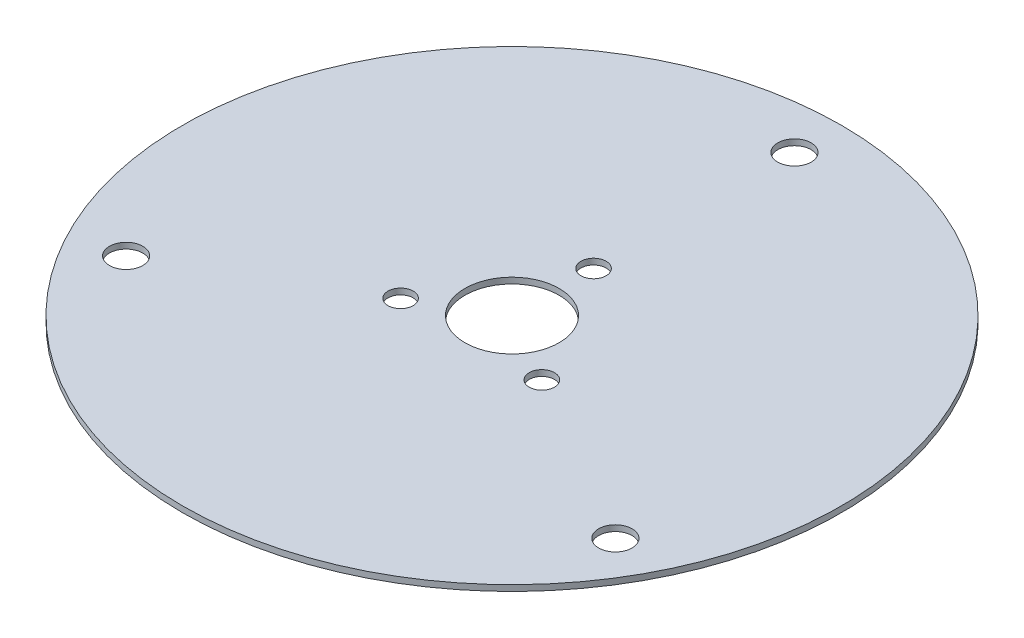
ISO-10303-21;
HEADER;
FILE_DESCRIPTION(('STEP AP214'),'2;1');
FILE_NAME('part.step','',(''),(''),'','','');
FILE_SCHEMA(('AUTOMOTIVE_DESIGN { 1 0 10303 214 1 1 1 1 }'));
ENDSEC;
DATA;
#1=APPLICATION_CONTEXT('core data for automotive mechanical design processes');
#2=APPLICATION_PROTOCOL_DEFINITION('international standard','automotive_design',2000,#1);
#3=PRODUCT_CONTEXT('',#1,'mechanical');
#4=PRODUCT('Part','Part','',(#3));
#5=PRODUCT_RELATED_PRODUCT_CATEGORY('part','',(#4));
#6=PRODUCT_DEFINITION_FORMATION('','',#4);
#7=PRODUCT_DEFINITION_CONTEXT('part definition',#1,'design');
#8=PRODUCT_DEFINITION('design','',#6,#7);
#9=PRODUCT_DEFINITION_SHAPE('','',#8);
#10=(LENGTH_UNIT() NAMED_UNIT(*) SI_UNIT(.MILLI.,.METRE.));
#11=(NAMED_UNIT(*) PLANE_ANGLE_UNIT() SI_UNIT($,.RADIAN.));
#12=(NAMED_UNIT(*) SI_UNIT($,.STERADIAN.) SOLID_ANGLE_UNIT());
#13=UNCERTAINTY_MEASURE_WITH_UNIT(LENGTH_MEASURE(1.E-05),#10,'distance_accuracy_value','');
#14=(GEOMETRIC_REPRESENTATION_CONTEXT(3) GLOBAL_UNCERTAINTY_ASSIGNED_CONTEXT((#13)) GLOBAL_UNIT_ASSIGNED_CONTEXT((#10,
#11,#12)) REPRESENTATION_CONTEXT('',''));
#15=CARTESIAN_POINT('',(0.,0.,0.));
#16=DIRECTION('',(0.,0.,1.));
#17=DIRECTION('',(1.,0.,0.));
#18=AXIS2_PLACEMENT_3D('',#15,#16,#17);
#19=CARTESIAN_POINT('',(0.,0.8,0.));
#20=DIRECTION('',(0.,-1.,0.));
#21=DIRECTION('',(0.,0.,-1.));
#22=AXIS2_PLACEMENT_3D('',#19,#20,#21);
#23=CYLINDRICAL_SURFACE('',#22,44.45);
#24=CARTESIAN_POINT('',(0.,0.8,0.));
#25=DIRECTION('',(0.,1.,0.));
#26=DIRECTION('',(0.,0.,1.));
#27=AXIS2_PLACEMENT_3D('',#24,#25,#26);
#28=CIRCLE('',#27,44.45);
#29=CARTESIAN_POINT('',(0.,0.8,44.45));
#30=VERTEX_POINT('',#29);
#31=EDGE_CURVE('E10',#30,#30,#28,.T.);
#32=ORIENTED_EDGE('',*,*,#31,.F.);
#33=EDGE_LOOP('',(#32));
#34=FACE_BOUND('',#33,.T.);
#35=CARTESIAN_POINT('',(0.,0.,0.));
#36=DIRECTION('',(0.,1.,0.));
#37=DIRECTION('',(0.,0.,1.));
#38=AXIS2_PLACEMENT_3D('',#35,#36,#37);
#39=CIRCLE('',#38,44.45);
#40=CARTESIAN_POINT('',(0.,0.,44.45));
#41=VERTEX_POINT('',#40);
#42=EDGE_CURVE('E38',#41,#41,#39,.T.);
#43=ORIENTED_EDGE('',*,*,#42,.T.);
#44=EDGE_LOOP('',(#43));
#45=FACE_BOUND('',#44,.T.);
#46=ADVANCED_FACE('F35',(#34,#45),#23,.T.);
#47=CARTESIAN_POINT('',(0.,0.8,0.));
#48=DIRECTION('',(0.,1.,0.));
#49=DIRECTION('',(0.,0.,1.));
#50=AXIS2_PLACEMENT_3D('',#47,#48,#49);
#51=PLANE('',#50);
#52=CARTESIAN_POINT('',(0.,0.800000000000001,-11.));
#53=DIRECTION('',(0.,1.,0.));
#54=DIRECTION('',(0.,0.,1.));
#55=AXIS2_PLACEMENT_3D('',#52,#53,#54);
#56=CIRCLE('',#55,1.69999999999999);
#57=CARTESIAN_POINT('',(0.,0.800000000000001,-9.30000000000001));
#58=VERTEX_POINT('',#57);
#59=EDGE_CURVE('E100',#58,#58,#56,.T.);
#60=ORIENTED_EDGE('',*,*,#59,.F.);
#61=EDGE_LOOP('',(#60));
#62=FACE_BOUND('',#61,.T.);
#63=CARTESIAN_POINT('',(-9.52627944162882,0.800000000000001,5.5));
#64=DIRECTION('',(0.,1.,0.));
#65=DIRECTION('',(0.,0.,1.));
#66=AXIS2_PLACEMENT_3D('',#63,#64,#65);
#67=CIRCLE('',#66,1.69999999999999);
#68=CARTESIAN_POINT('',(-9.52627944162882,0.800000000000001,7.19999999999999));
#69=VERTEX_POINT('',#68);
#70=EDGE_CURVE('E92',#69,#69,#67,.T.);
#71=ORIENTED_EDGE('',*,*,#70,.F.);
#72=EDGE_LOOP('',(#71));
#73=FACE_BOUND('',#72,.T.);
#74=CARTESIAN_POINT('',(9.52627944162882,0.800000000000001,5.5));
#75=DIRECTION('',(0.,1.,0.));
#76=DIRECTION('',(0.,0.,1.));
#77=AXIS2_PLACEMENT_3D('',#74,#75,#76);
#78=CIRCLE('',#77,1.69999999999999);
#79=CARTESIAN_POINT('',(9.52627944162882,0.800000000000001,7.19999999999999));
#80=VERTEX_POINT('',#79);
#81=EDGE_CURVE('E84',#80,#80,#78,.T.);
#82=ORIENTED_EDGE('',*,*,#81,.F.);
#83=EDGE_LOOP('',(#82));
#84=FACE_BOUND('',#83,.T.);
#85=CARTESIAN_POINT('',(0.,0.8,0.));
#86=DIRECTION('',(0.,1.,0.));
#87=DIRECTION('',(0.,0.,1.));
#88=AXIS2_PLACEMENT_3D('',#85,#86,#87);
#89=CIRCLE('',#88,6.35);
#90=CARTESIAN_POINT('',(0.,0.8,6.35));
#91=VERTEX_POINT('',#90);
#92=EDGE_CURVE('E73',#91,#91,#89,.T.);
#93=ORIENTED_EDGE('',*,*,#92,.F.);
#94=EDGE_LOOP('',(#93));
#95=FACE_BOUND('',#94,.T.);
#96=CARTESIAN_POINT('',(0.,0.8,-38.1));
#97=DIRECTION('',(0.,1.,0.));
#98=DIRECTION('',(0.,0.,1.));
#99=AXIS2_PLACEMENT_3D('',#96,#97,#98);
#100=CIRCLE('',#99,2.25);
#101=CARTESIAN_POINT('',(0.,0.8,-35.85));
#102=VERTEX_POINT('',#101);
#103=EDGE_CURVE('E68',#102,#102,#100,.T.);
#104=ORIENTED_EDGE('',*,*,#103,.F.);
#105=EDGE_LOOP('',(#104));
#106=FACE_BOUND('',#105,.T.);
#107=CARTESIAN_POINT('',(-32.9955678841873,0.8,19.0499999999997));
#108=DIRECTION('',(0.,1.,0.));
#109=DIRECTION('',(0.,0.,1.));
#110=AXIS2_PLACEMENT_3D('',#107,#108,#109);
#111=CIRCLE('',#110,2.25);
#112=CARTESIAN_POINT('',(-32.9955678841873,0.8,21.2999999999997));
#113=VERTEX_POINT('',#112);
#114=EDGE_CURVE('E60',#113,#113,#111,.T.);
#115=ORIENTED_EDGE('',*,*,#114,.F.);
#116=EDGE_LOOP('',(#115));
#117=FACE_BOUND('',#116,.T.);
#118=CARTESIAN_POINT('',(32.995567884187,0.8,19.0500000000002));
#119=DIRECTION('',(0.,1.,0.));
#120=DIRECTION('',(0.,0.,1.));
#121=AXIS2_PLACEMENT_3D('',#118,#119,#120);
#122=CIRCLE('',#121,2.25);
#123=CARTESIAN_POINT('',(32.995567884187,0.8,21.3000000000002));
#124=VERTEX_POINT('',#123);
#125=EDGE_CURVE('E52',#124,#124,#122,.T.);
#126=ORIENTED_EDGE('',*,*,#125,.F.);
#127=EDGE_LOOP('',(#126));
#128=FACE_BOUND('',#127,.T.);
#129=ORIENTED_EDGE('',*,*,#31,.T.);
#130=EDGE_LOOP('',(#129));
#131=FACE_BOUND('',#130,.T.);
#132=ADVANCED_FACE('F107',(#62,#73,#84,#95,#106,#117,#128,#131),#51,.T.);
#133=CARTESIAN_POINT('',(0.,0.,0.));
#134=DIRECTION('',(0.,1.,0.));
#135=DIRECTION('',(0.,0.,1.));
#136=AXIS2_PLACEMENT_3D('',#133,#134,#135);
#137=PLANE('',#136);
#138=CARTESIAN_POINT('',(0.,0.,-11.));
#139=DIRECTION('',(0.,1.,0.));
#140=DIRECTION('',(0.,0.,1.));
#141=AXIS2_PLACEMENT_3D('',#138,#139,#140);
#142=CIRCLE('',#141,1.7);
#143=CARTESIAN_POINT('',(0.,0.,-9.3));
#144=VERTEX_POINT('',#143);
#145=EDGE_CURVE('E96',#144,#144,#142,.T.);
#146=ORIENTED_EDGE('',*,*,#145,.T.);
#147=EDGE_LOOP('',(#146));
#148=FACE_BOUND('',#147,.T.);
#149=CARTESIAN_POINT('',(-9.52627944162882,0.,5.5));
#150=DIRECTION('',(0.,1.,0.));
#151=DIRECTION('',(0.,0.,1.));
#152=AXIS2_PLACEMENT_3D('',#149,#150,#151);
#153=CIRCLE('',#152,1.7);
#154=CARTESIAN_POINT('',(-9.52627944162882,0.,7.2));
#155=VERTEX_POINT('',#154);
#156=EDGE_CURVE('E88',#155,#155,#153,.T.);
#157=ORIENTED_EDGE('',*,*,#156,.T.);
#158=EDGE_LOOP('',(#157));
#159=FACE_BOUND('',#158,.T.);
#160=CARTESIAN_POINT('',(9.52627944162882,0.,5.5));
#161=DIRECTION('',(0.,1.,0.));
#162=DIRECTION('',(0.,0.,1.));
#163=AXIS2_PLACEMENT_3D('',#160,#161,#162);
#164=CIRCLE('',#163,1.7);
#165=CARTESIAN_POINT('',(9.52627944162882,0.,7.2));
#166=VERTEX_POINT('',#165);
#167=EDGE_CURVE('E77',#166,#166,#164,.T.);
#168=ORIENTED_EDGE('',*,*,#167,.T.);
#169=EDGE_LOOP('',(#168));
#170=FACE_BOUND('',#169,.T.);
#171=CARTESIAN_POINT('',(0.,0.,0.));
#172=DIRECTION('',(0.,1.,0.));
#173=DIRECTION('',(0.,0.,1.));
#174=AXIS2_PLACEMENT_3D('',#171,#172,#173);
#175=CIRCLE('',#174,6.35);
#176=CARTESIAN_POINT('',(0.,0.,6.35));
#177=VERTEX_POINT('',#176);
#178=EDGE_CURVE('E72',#177,#177,#175,.T.);
#179=ORIENTED_EDGE('',*,*,#178,.T.);
#180=EDGE_LOOP('',(#179));
#181=FACE_BOUND('',#180,.T.);
#182=CARTESIAN_POINT('',(0.,0.,-38.1));
#183=DIRECTION('',(0.,1.,0.));
#184=DIRECTION('',(0.,0.,1.));
#185=AXIS2_PLACEMENT_3D('',#182,#183,#184);
#186=CIRCLE('',#185,2.25);
#187=CARTESIAN_POINT('',(0.,0.,-35.85));
#188=VERTEX_POINT('',#187);
#189=EDGE_CURVE('E64',#188,#188,#186,.T.);
#190=ORIENTED_EDGE('',*,*,#189,.T.);
#191=EDGE_LOOP('',(#190));
#192=FACE_BOUND('',#191,.T.);
#193=CARTESIAN_POINT('',(-32.9955678841873,0.,19.0499999999997));
#194=DIRECTION('',(0.,1.,0.));
#195=DIRECTION('',(0.,0.,1.));
#196=AXIS2_PLACEMENT_3D('',#193,#194,#195);
#197=CIRCLE('',#196,2.25);
#198=CARTESIAN_POINT('',(-32.9955678841873,0.,21.2999999999997));
#199=VERTEX_POINT('',#198);
#200=EDGE_CURVE('E56',#199,#199,#197,.T.);
#201=ORIENTED_EDGE('',*,*,#200,.T.);
#202=EDGE_LOOP('',(#201));
#203=FACE_BOUND('',#202,.T.);
#204=CARTESIAN_POINT('',(32.995567884187,0.,19.0500000000002));
#205=DIRECTION('',(0.,1.,0.));
#206=DIRECTION('',(0.,0.,1.));
#207=AXIS2_PLACEMENT_3D('',#204,#205,#206);
#208=CIRCLE('',#207,2.25);
#209=CARTESIAN_POINT('',(32.995567884187,0.,21.3000000000002));
#210=VERTEX_POINT('',#209);
#211=EDGE_CURVE('E47',#210,#210,#208,.T.);
#212=ORIENTED_EDGE('',*,*,#211,.T.);
#213=EDGE_LOOP('',(#212));
#214=FACE_BOUND('',#213,.T.);
#215=ORIENTED_EDGE('',*,*,#42,.F.);
#216=EDGE_LOOP('',(#215));
#217=FACE_BOUND('',#216,.T.);
#218=ADVANCED_FACE('F110',(#148,#159,#170,#181,#192,#203,#214,#217),#137,.F.);
#219=CARTESIAN_POINT('',(32.995567884187,0.8,19.0500000000002));
#220=DIRECTION('',(0.,1.,0.));
#221=DIRECTION('',(0.,0.,1.));
#222=AXIS2_PLACEMENT_3D('',#219,#220,#221);
#223=CYLINDRICAL_SURFACE('',#222,2.25);
#224=ORIENTED_EDGE('',*,*,#211,.F.);
#225=EDGE_LOOP('',(#224));
#226=FACE_BOUND('',#225,.T.);
#227=ORIENTED_EDGE('',*,*,#125,.T.);
#228=EDGE_LOOP('',(#227));
#229=FACE_BOUND('',#228,.T.);
#230=ADVANCED_FACE('F124',(#226,#229),#223,.F.);
#231=CARTESIAN_POINT('',(-32.9955678841873,0.8,19.0499999999997));
#232=DIRECTION('',(0.,1.,0.));
#233=DIRECTION('',(0.,0.,1.));
#234=AXIS2_PLACEMENT_3D('',#231,#232,#233);
#235=CYLINDRICAL_SURFACE('',#234,2.25);
#236=ORIENTED_EDGE('',*,*,#200,.F.);
#237=EDGE_LOOP('',(#236));
#238=FACE_BOUND('',#237,.T.);
#239=ORIENTED_EDGE('',*,*,#114,.T.);
#240=EDGE_LOOP('',(#239));
#241=FACE_BOUND('',#240,.T.);
#242=ADVANCED_FACE('F126',(#238,#241),#235,.F.);
#243=CARTESIAN_POINT('',(0.,0.8,-38.1));
#244=DIRECTION('',(0.,1.,0.));
#245=DIRECTION('',(0.,0.,1.));
#246=AXIS2_PLACEMENT_3D('',#243,#244,#245);
#247=CYLINDRICAL_SURFACE('',#246,2.25);
#248=ORIENTED_EDGE('',*,*,#189,.F.);
#249=EDGE_LOOP('',(#248));
#250=FACE_BOUND('',#249,.T.);
#251=ORIENTED_EDGE('',*,*,#103,.T.);
#252=EDGE_LOOP('',(#251));
#253=FACE_BOUND('',#252,.T.);
#254=ADVANCED_FACE('F133',(#250,#253),#247,.F.);
#255=CARTESIAN_POINT('',(0.,0.,0.));
#256=DIRECTION('',(0.,1.,0.));
#257=DIRECTION('',(0.,0.,1.));
#258=AXIS2_PLACEMENT_3D('',#255,#256,#257);
#259=CYLINDRICAL_SURFACE('',#258,6.35);
#260=ORIENTED_EDGE('',*,*,#178,.F.);
#261=EDGE_LOOP('',(#260));
#262=FACE_BOUND('',#261,.T.);
#263=ORIENTED_EDGE('',*,*,#92,.T.);
#264=EDGE_LOOP('',(#263));
#265=FACE_BOUND('',#264,.T.);
#266=ADVANCED_FACE('F157',(#262,#265),#259,.F.);
#267=CARTESIAN_POINT('',(9.52627944162882,0.8,5.5));
#268=DIRECTION('',(0.,1.,0.));
#269=DIRECTION('',(0.,0.,1.));
#270=AXIS2_PLACEMENT_3D('',#267,#268,#269);
#271=CYLINDRICAL_SURFACE('',#270,1.69999999999999);
#272=ORIENTED_EDGE('',*,*,#167,.F.);
#273=EDGE_LOOP('',(#272));
#274=FACE_BOUND('',#273,.T.);
#275=ORIENTED_EDGE('',*,*,#81,.T.);
#276=EDGE_LOOP('',(#275));
#277=FACE_BOUND('',#276,.T.);
#278=ADVANCED_FACE('F160',(#274,#277),#271,.F.);
#279=CARTESIAN_POINT('',(-9.52627944162882,0.8,5.5));
#280=DIRECTION('',(0.,1.,0.));
#281=DIRECTION('',(0.,0.,1.));
#282=AXIS2_PLACEMENT_3D('',#279,#280,#281);
#283=CYLINDRICAL_SURFACE('',#282,1.69999999999999);
#284=ORIENTED_EDGE('',*,*,#156,.F.);
#285=EDGE_LOOP('',(#284));
#286=FACE_BOUND('',#285,.T.);
#287=ORIENTED_EDGE('',*,*,#70,.T.);
#288=EDGE_LOOP('',(#287));
#289=FACE_BOUND('',#288,.T.);
#290=ADVANCED_FACE('F172',(#286,#289),#283,.F.);
#291=CARTESIAN_POINT('',(0.,0.8,-11.));
#292=DIRECTION('',(0.,1.,0.));
#293=DIRECTION('',(0.,0.,1.));
#294=AXIS2_PLACEMENT_3D('',#291,#292,#293);
#295=CYLINDRICAL_SURFACE('',#294,1.69999999999999);
#296=ORIENTED_EDGE('',*,*,#145,.F.);
#297=EDGE_LOOP('',(#296));
#298=FACE_BOUND('',#297,.T.);
#299=ORIENTED_EDGE('',*,*,#59,.T.);
#300=EDGE_LOOP('',(#299));
#301=FACE_BOUND('',#300,.T.);
#302=ADVANCED_FACE('F105',(#298,#301),#295,.F.);
#303=CLOSED_SHELL('',(#46,#132,#218,#230,#242,#254,#266,#278,#290,#302));
#304=MANIFOLD_SOLID_BREP('B2',#303);
#305=ADVANCED_BREP_SHAPE_REPRESENTATION('',(#18,#304),#14);
#306=SHAPE_DEFINITION_REPRESENTATION(#9,#305);
ENDSEC;
END-ISO-10303-21;
